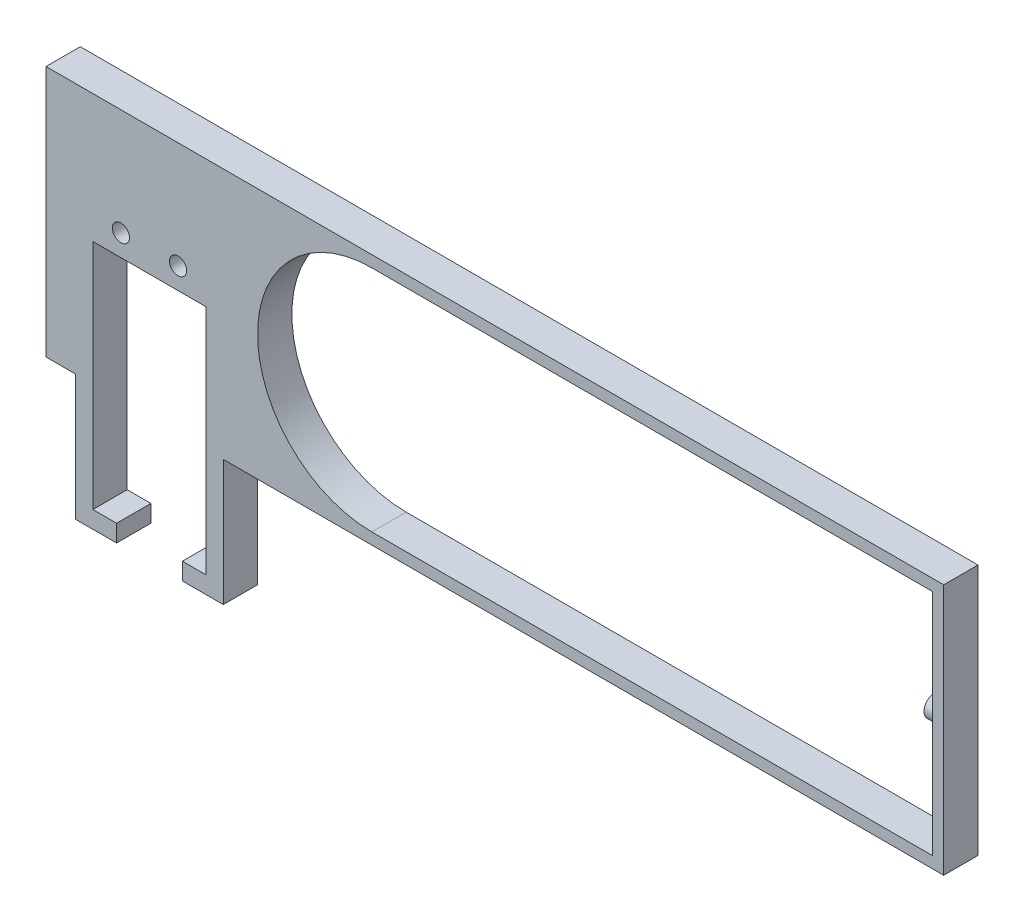
ISO-10303-21;
HEADER;
FILE_DESCRIPTION(('STEP AP214'),'2;1');
FILE_NAME('part.step','',(''),(''),'','','');
FILE_SCHEMA(('AUTOMOTIVE_DESIGN { 1 0 10303 214 1 1 1 1 }'));
ENDSEC;
DATA;
#1=APPLICATION_CONTEXT('core data for automotive mechanical design processes');
#2=APPLICATION_PROTOCOL_DEFINITION('international standard','automotive_design',2000,#1);
#3=PRODUCT_CONTEXT('',#1,'mechanical');
#4=PRODUCT('Part','Part','',(#3));
#5=PRODUCT_RELATED_PRODUCT_CATEGORY('part','',(#4));
#6=PRODUCT_DEFINITION_FORMATION('','',#4);
#7=PRODUCT_DEFINITION_CONTEXT('part definition',#1,'design');
#8=PRODUCT_DEFINITION('design','',#6,#7);
#9=PRODUCT_DEFINITION_SHAPE('','',#8);
#10=(LENGTH_UNIT() NAMED_UNIT(*) SI_UNIT(.MILLI.,.METRE.));
#11=(NAMED_UNIT(*) PLANE_ANGLE_UNIT() SI_UNIT($,.RADIAN.));
#12=(NAMED_UNIT(*) SI_UNIT($,.STERADIAN.) SOLID_ANGLE_UNIT());
#13=UNCERTAINTY_MEASURE_WITH_UNIT(LENGTH_MEASURE(1.E-05),#10,'distance_accuracy_value','');
#14=(GEOMETRIC_REPRESENTATION_CONTEXT(3) GLOBAL_UNCERTAINTY_ASSIGNED_CONTEXT((#13)) GLOBAL_UNIT_ASSIGNED_CONTEXT((#10,
#11,#12)) REPRESENTATION_CONTEXT('',''));
#15=CARTESIAN_POINT('',(0.,0.,0.));
#16=DIRECTION('',(0.,0.,1.));
#17=DIRECTION('',(1.,0.,0.));
#18=AXIS2_PLACEMENT_3D('',#15,#16,#17);
#19=CARTESIAN_POINT('',(0.,0.,6.));
#20=DIRECTION('',(0.,0.,1.));
#21=DIRECTION('',(1.,0.,0.));
#22=AXIS2_PLACEMENT_3D('',#19,#20,#21);
#23=PLANE('',#22);
#24=CARTESIAN_POINT('',(-43.9,25.353,6.));
#25=DIRECTION('',(0.,0.,1.));
#26=DIRECTION('',(1.,0.,0.));
#27=AXIS2_PLACEMENT_3D('',#24,#25,#26);
#28=CIRCLE('',#27,1.5);
#29=CARTESIAN_POINT('',(-42.4,25.353,6.));
#30=VERTEX_POINT('',#29);
#31=EDGE_CURVE('E235',#30,#30,#28,.T.);
#32=ORIENTED_EDGE('',*,*,#31,.F.);
#33=EDGE_LOOP('',(#32));
#34=FACE_BOUND('',#33,.T.);
#35=DIRECTION('',(1.,0.,0.));
#36=VECTOR('',#35,1.);
#37=CARTESIAN_POINT('',(0.,0.,6.));
#38=LINE('',#37,#36);
#39=CARTESIAN_POINT('',(-26.,0.,6.));
#40=VERTEX_POINT('',#39);
#41=CARTESIAN_POINT('',(100.,0.,6.));
#42=VERTEX_POINT('',#41);
#43=EDGE_CURVE('E243',#40,#42,#38,.T.);
#44=ORIENTED_EDGE('',*,*,#43,.T.);
#45=DIRECTION('',(0.,1.,0.));
#46=VECTOR('',#45,1.);
#47=CARTESIAN_POINT('',(100.,0.,6.));
#48=LINE('',#47,#46);
#49=CARTESIAN_POINT('',(100.,44.,6.));
#50=VERTEX_POINT('',#49);
#51=EDGE_CURVE('E246',#42,#50,#48,.T.);
#52=ORIENTED_EDGE('',*,*,#51,.T.);
#53=DIRECTION('',(-1.,0.,0.));
#54=VECTOR('',#53,1.);
#55=CARTESIAN_POINT('',(100.,44.,6.));
#56=LINE('',#55,#54);
#57=CARTESIAN_POINT('',(-57.,44.,6.));
#58=VERTEX_POINT('',#57);
#59=EDGE_CURVE('E250',#50,#58,#56,.T.);
#60=ORIENTED_EDGE('',*,*,#59,.T.);
#61=DIRECTION('',(0.,-1.,0.));
#62=VECTOR('',#61,1.);
#63=CARTESIAN_POINT('',(-57.,44.,6.));
#64=LINE('',#63,#62);
#65=CARTESIAN_POINT('',(-57.,0.,6.));
#66=VERTEX_POINT('',#65);
#67=EDGE_CURVE('E253',#58,#66,#64,.T.);
#68=ORIENTED_EDGE('',*,*,#67,.T.);
#69=DIRECTION('',(1.,0.,0.));
#70=VECTOR('',#69,1.);
#71=CARTESIAN_POINT('',(-57.,0.,6.));
#72=LINE('',#71,#70);
#73=CARTESIAN_POINT('',(-51.8,0.,6.));
#74=VERTEX_POINT('',#73);
#75=EDGE_CURVE('E256',#66,#74,#72,.T.);
#76=ORIENTED_EDGE('',*,*,#75,.T.);
#77=DIRECTION('',(0.,-1.,0.));
#78=VECTOR('',#77,1.);
#79=CARTESIAN_POINT('',(-51.8,0.,6.));
#80=LINE('',#79,#78);
#81=CARTESIAN_POINT('',(-51.8,-22.,6.));
#82=VERTEX_POINT('',#81);
#83=EDGE_CURVE('E259',#74,#82,#80,.T.);
#84=ORIENTED_EDGE('',*,*,#83,.T.);
#85=DIRECTION('',(1.,0.,0.));
#86=VECTOR('',#85,1.);
#87=CARTESIAN_POINT('',(-51.8,-22.,6.));
#88=LINE('',#87,#86);
#89=CARTESIAN_POINT('',(-44.65,-22.,6.));
#90=VERTEX_POINT('',#89);
#91=EDGE_CURVE('E262',#82,#90,#88,.T.);
#92=ORIENTED_EDGE('',*,*,#91,.T.);
#93=DIRECTION('',(0.,1.,0.));
#94=VECTOR('',#93,1.);
#95=CARTESIAN_POINT('',(-44.65,-22.,6.));
#96=LINE('',#95,#94);
#97=CARTESIAN_POINT('',(-44.65,-19.,6.));
#98=VERTEX_POINT('',#97);
#99=EDGE_CURVE('E265',#90,#98,#96,.T.);
#100=ORIENTED_EDGE('',*,*,#99,.T.);
#101=DIRECTION('',(-1.,0.,0.));
#102=VECTOR('',#101,1.);
#103=CARTESIAN_POINT('',(-44.65,-19.,6.));
#104=LINE('',#103,#102);
#105=CARTESIAN_POINT('',(-48.8,-19.,6.));
#106=VERTEX_POINT('',#105);
#107=EDGE_CURVE('E268',#98,#106,#104,.T.);
#108=ORIENTED_EDGE('',*,*,#107,.T.);
#109=DIRECTION('',(0.,1.,0.));
#110=VECTOR('',#109,1.);
#111=CARTESIAN_POINT('',(-48.8,-19.,6.));
#112=LINE('',#111,#110);
#113=CARTESIAN_POINT('',(-48.8,21.6,6.));
#114=VERTEX_POINT('',#113);
#115=EDGE_CURVE('E271',#106,#114,#112,.T.);
#116=ORIENTED_EDGE('',*,*,#115,.T.);
#117=DIRECTION('',(1.,0.,0.));
#118=VECTOR('',#117,1.);
#119=CARTESIAN_POINT('',(-48.8,21.6,6.));
#120=LINE('',#119,#118);
#121=CARTESIAN_POINT('',(-29.,21.6,6.));
#122=VERTEX_POINT('',#121);
#123=EDGE_CURVE('E274',#114,#122,#120,.T.);
#124=ORIENTED_EDGE('',*,*,#123,.T.);
#125=DIRECTION('',(0.,-1.,0.));
#126=VECTOR('',#125,1.);
#127=CARTESIAN_POINT('',(-29.,21.6,6.));
#128=LINE('',#127,#126);
#129=CARTESIAN_POINT('',(-29.,-19.,6.));
#130=VERTEX_POINT('',#129);
#131=EDGE_CURVE('E277',#122,#130,#128,.T.);
#132=ORIENTED_EDGE('',*,*,#131,.T.);
#133=DIRECTION('',(-1.,0.,0.));
#134=VECTOR('',#133,1.);
#135=CARTESIAN_POINT('',(-29.,-19.,6.));
#136=LINE('',#135,#134);
#137=CARTESIAN_POINT('',(-33.15,-19.,6.));
#138=VERTEX_POINT('',#137);
#139=EDGE_CURVE('E280',#130,#138,#136,.T.);
#140=ORIENTED_EDGE('',*,*,#139,.T.);
#141=DIRECTION('',(0.,-1.,0.));
#142=VECTOR('',#141,1.);
#143=CARTESIAN_POINT('',(-33.15,-19.,6.));
#144=LINE('',#143,#142);
#145=CARTESIAN_POINT('',(-33.15,-22.,6.));
#146=VERTEX_POINT('',#145);
#147=EDGE_CURVE('E283',#138,#146,#144,.T.);
#148=ORIENTED_EDGE('',*,*,#147,.T.);
#149=DIRECTION('',(1.,0.,0.));
#150=VECTOR('',#149,1.);
#151=CARTESIAN_POINT('',(-33.15,-22.,6.));
#152=LINE('',#151,#150);
#153=CARTESIAN_POINT('',(-26.,-22.,6.));
#154=VERTEX_POINT('',#153);
#155=EDGE_CURVE('E286',#146,#154,#152,.T.);
#156=ORIENTED_EDGE('',*,*,#155,.T.);
#157=DIRECTION('',(0.,1.,0.));
#158=VECTOR('',#157,1.);
#159=CARTESIAN_POINT('',(-26.,0.,6.));
#160=LINE('',#159,#158);
#161=EDGE_CURVE('E289',#154,#40,#160,.T.);
#162=ORIENTED_EDGE('',*,*,#161,.T.);
#163=EDGE_LOOP('',(#44,#52,#60,#68,#76,#84,#92,#100,#108,#116,#124,#132,#140,#148,#156,#162));
#164=FACE_BOUND('',#163,.T.);
#165=CARTESIAN_POINT('',(-33.9,25.353,6.));
#166=DIRECTION('',(0.,0.,1.));
#167=DIRECTION('',(1.,0.,0.));
#168=AXIS2_PLACEMENT_3D('',#165,#166,#167);
#169=CIRCLE('',#168,1.5);
#170=CARTESIAN_POINT('',(-32.4,25.353,6.));
#171=VERTEX_POINT('',#170);
#172=EDGE_CURVE('E227',#171,#171,#169,.T.);
#173=ORIENTED_EDGE('',*,*,#172,.F.);
#174=EDGE_LOOP('',(#173));
#175=FACE_BOUND('',#174,.T.);
#176=DIRECTION('',(1.,0.,0.));
#177=VECTOR('',#176,1.);
#178=CARTESIAN_POINT('',(0.,2.,6.));
#179=LINE('',#178,#177);
#180=CARTESIAN_POINT('',(0.,2.,6.));
#181=VERTEX_POINT('',#180);
#182=CARTESIAN_POINT('',(98.,2.00000000000004,6.));
#183=VERTEX_POINT('',#182);
#184=EDGE_CURVE('E186',#181,#183,#179,.T.);
#185=ORIENTED_EDGE('',*,*,#184,.F.);
#186=CARTESIAN_POINT('',(0.,22.,6.));
#187=DIRECTION('',(0.,0.,1.));
#188=DIRECTION('',(1.,0.,0.));
#189=AXIS2_PLACEMENT_3D('',#186,#187,#188);
#190=CIRCLE('',#189,20.);
#191=CARTESIAN_POINT('',(0.,42.,6.));
#192=VERTEX_POINT('',#191);
#193=EDGE_CURVE('E177',#192,#181,#190,.T.);
#194=ORIENTED_EDGE('',*,*,#193,.F.);
#195=DIRECTION('',(-1.,0.,0.));
#196=VECTOR('',#195,1.);
#197=CARTESIAN_POINT('',(98.,42.,6.));
#198=LINE('',#197,#196);
#199=CARTESIAN_POINT('',(98.,42.,6.));
#200=VERTEX_POINT('',#199);
#201=EDGE_CURVE('E203',#200,#192,#198,.T.);
#202=ORIENTED_EDGE('',*,*,#201,.F.);
#203=DIRECTION('',(0.,1.,0.));
#204=VECTOR('',#203,1.);
#205=CARTESIAN_POINT('',(98.,2.00000000000004,6.));
#206=LINE('',#205,#204);
#207=EDGE_CURVE('E199',#183,#200,#206,.T.);
#208=ORIENTED_EDGE('',*,*,#207,.F.);
#209=EDGE_LOOP('',(#185,#194,#202,#208));
#210=FACE_BOUND('',#209,.T.);
#211=ADVANCED_FACE('F39',(#34,#164,#175,#210),#23,.T.);
#212=CARTESIAN_POINT('',(0.,0.,0.));
#213=DIRECTION('',(0.,0.,1.));
#214=DIRECTION('',(1.,0.,0.));
#215=AXIS2_PLACEMENT_3D('',#212,#213,#214);
#216=PLANE('',#215);
#217=CARTESIAN_POINT('',(-33.9,25.353,0.));
#218=DIRECTION('',(0.,0.,1.));
#219=DIRECTION('',(1.,0.,0.));
#220=AXIS2_PLACEMENT_3D('',#217,#218,#219);
#221=CIRCLE('',#220,1.5);
#222=CARTESIAN_POINT('',(-32.4,25.353,0.));
#223=VERTEX_POINT('',#222);
#224=EDGE_CURVE('E195',#223,#223,#221,.T.);
#225=ORIENTED_EDGE('',*,*,#224,.T.);
#226=EDGE_LOOP('',(#225));
#227=FACE_BOUND('',#226,.T.);
#228=CARTESIAN_POINT('',(-43.9,25.353,0.));
#229=DIRECTION('',(0.,0.,1.));
#230=DIRECTION('',(1.,0.,0.));
#231=AXIS2_PLACEMENT_3D('',#228,#229,#230);
#232=CIRCLE('',#231,1.5);
#233=CARTESIAN_POINT('',(-42.4,25.353,0.));
#234=VERTEX_POINT('',#233);
#235=EDGE_CURVE('E231',#234,#234,#232,.T.);
#236=ORIENTED_EDGE('',*,*,#235,.T.);
#237=EDGE_LOOP('',(#236));
#238=FACE_BOUND('',#237,.T.);
#239=DIRECTION('',(1.,0.,0.));
#240=VECTOR('',#239,1.);
#241=CARTESIAN_POINT('',(0.,0.,0.));
#242=LINE('',#241,#240);
#243=CARTESIAN_POINT('',(-26.,0.,0.));
#244=VERTEX_POINT('',#243);
#245=CARTESIAN_POINT('',(100.,0.,0.));
#246=VERTEX_POINT('',#245);
#247=EDGE_CURVE('E239',#244,#246,#242,.T.);
#248=ORIENTED_EDGE('',*,*,#247,.F.);
#249=DIRECTION('',(0.,1.,0.));
#250=VECTOR('',#249,1.);
#251=CARTESIAN_POINT('',(-26.,0.,0.));
#252=LINE('',#251,#250);
#253=CARTESIAN_POINT('',(-26.,-22.,0.));
#254=VERTEX_POINT('',#253);
#255=EDGE_CURVE('E247',#254,#244,#252,.T.);
#256=ORIENTED_EDGE('',*,*,#255,.F.);
#257=DIRECTION('',(1.,0.,0.));
#258=VECTOR('',#257,1.);
#259=CARTESIAN_POINT('',(-33.15,-22.,0.));
#260=LINE('',#259,#258);
#261=CARTESIAN_POINT('',(-33.15,-22.,0.));
#262=VERTEX_POINT('',#261);
#263=EDGE_CURVE('E335',#262,#254,#260,.T.);
#264=ORIENTED_EDGE('',*,*,#263,.F.);
#265=DIRECTION('',(0.,-1.,0.));
#266=VECTOR('',#265,1.);
#267=CARTESIAN_POINT('',(-33.15,-19.,0.));
#268=LINE('',#267,#266);
#269=CARTESIAN_POINT('',(-33.15,-19.,0.));
#270=VERTEX_POINT('',#269);
#271=EDGE_CURVE('E332',#270,#262,#268,.T.);
#272=ORIENTED_EDGE('',*,*,#271,.F.);
#273=DIRECTION('',(-1.,0.,0.));
#274=VECTOR('',#273,1.);
#275=CARTESIAN_POINT('',(-29.,-19.,0.));
#276=LINE('',#275,#274);
#277=CARTESIAN_POINT('',(-29.,-19.,0.));
#278=VERTEX_POINT('',#277);
#279=EDGE_CURVE('E329',#278,#270,#276,.T.);
#280=ORIENTED_EDGE('',*,*,#279,.F.);
#281=DIRECTION('',(0.,-1.,0.));
#282=VECTOR('',#281,1.);
#283=CARTESIAN_POINT('',(-29.,21.6,0.));
#284=LINE('',#283,#282);
#285=CARTESIAN_POINT('',(-29.,21.6,0.));
#286=VERTEX_POINT('',#285);
#287=EDGE_CURVE('E326',#286,#278,#284,.T.);
#288=ORIENTED_EDGE('',*,*,#287,.F.);
#289=DIRECTION('',(1.,0.,0.));
#290=VECTOR('',#289,1.);
#291=CARTESIAN_POINT('',(-48.8,21.6,0.));
#292=LINE('',#291,#290);
#293=CARTESIAN_POINT('',(-48.8,21.6,0.));
#294=VERTEX_POINT('',#293);
#295=EDGE_CURVE('E323',#294,#286,#292,.T.);
#296=ORIENTED_EDGE('',*,*,#295,.F.);
#297=DIRECTION('',(0.,1.,0.));
#298=VECTOR('',#297,1.);
#299=CARTESIAN_POINT('',(-48.8,-19.,0.));
#300=LINE('',#299,#298);
#301=CARTESIAN_POINT('',(-48.8,-19.,0.));
#302=VERTEX_POINT('',#301);
#303=EDGE_CURVE('E320',#302,#294,#300,.T.);
#304=ORIENTED_EDGE('',*,*,#303,.F.);
#305=DIRECTION('',(-1.,0.,0.));
#306=VECTOR('',#305,1.);
#307=CARTESIAN_POINT('',(-44.65,-19.,0.));
#308=LINE('',#307,#306);
#309=CARTESIAN_POINT('',(-44.65,-19.,0.));
#310=VERTEX_POINT('',#309);
#311=EDGE_CURVE('E317',#310,#302,#308,.T.);
#312=ORIENTED_EDGE('',*,*,#311,.F.);
#313=DIRECTION('',(0.,1.,0.));
#314=VECTOR('',#313,1.);
#315=CARTESIAN_POINT('',(-44.65,-22.,0.));
#316=LINE('',#315,#314);
#317=CARTESIAN_POINT('',(-44.65,-22.,0.));
#318=VERTEX_POINT('',#317);
#319=EDGE_CURVE('E314',#318,#310,#316,.T.);
#320=ORIENTED_EDGE('',*,*,#319,.F.);
#321=DIRECTION('',(1.,0.,0.));
#322=VECTOR('',#321,1.);
#323=CARTESIAN_POINT('',(-51.8,-22.,0.));
#324=LINE('',#323,#322);
#325=CARTESIAN_POINT('',(-51.8,-22.,0.));
#326=VERTEX_POINT('',#325);
#327=EDGE_CURVE('E311',#326,#318,#324,.T.);
#328=ORIENTED_EDGE('',*,*,#327,.F.);
#329=DIRECTION('',(0.,-1.,0.));
#330=VECTOR('',#329,1.);
#331=CARTESIAN_POINT('',(-51.8,0.,0.));
#332=LINE('',#331,#330);
#333=CARTESIAN_POINT('',(-51.8,0.,0.));
#334=VERTEX_POINT('',#333);
#335=EDGE_CURVE('E308',#334,#326,#332,.T.);
#336=ORIENTED_EDGE('',*,*,#335,.F.);
#337=DIRECTION('',(1.,0.,0.));
#338=VECTOR('',#337,1.);
#339=CARTESIAN_POINT('',(-57.,0.,0.));
#340=LINE('',#339,#338);
#341=CARTESIAN_POINT('',(-57.,0.,0.));
#342=VERTEX_POINT('',#341);
#343=EDGE_CURVE('E305',#342,#334,#340,.T.);
#344=ORIENTED_EDGE('',*,*,#343,.F.);
#345=DIRECTION('',(0.,-1.,0.));
#346=VECTOR('',#345,1.);
#347=CARTESIAN_POINT('',(-57.,44.,0.));
#348=LINE('',#347,#346);
#349=CARTESIAN_POINT('',(-57.,44.,0.));
#350=VERTEX_POINT('',#349);
#351=EDGE_CURVE('E302',#350,#342,#348,.T.);
#352=ORIENTED_EDGE('',*,*,#351,.F.);
#353=DIRECTION('',(-1.,0.,0.));
#354=VECTOR('',#353,1.);
#355=CARTESIAN_POINT('',(0.,44.,0.));
#356=LINE('',#355,#354);
#357=CARTESIAN_POINT('',(100.,44.,0.));
#358=VERTEX_POINT('',#357);
#359=EDGE_CURVE('E299',#358,#350,#356,.T.);
#360=ORIENTED_EDGE('',*,*,#359,.F.);
#361=DIRECTION('',(0.,1.,0.));
#362=VECTOR('',#361,1.);
#363=CARTESIAN_POINT('',(100.,0.,0.));
#364=LINE('',#363,#362);
#365=EDGE_CURVE('E295',#246,#358,#364,.T.);
#366=ORIENTED_EDGE('',*,*,#365,.F.);
#367=EDGE_LOOP('',(#248,#256,#264,#272,#280,#288,#296,#304,#312,#320,#328,#336,#344,#352,#360,#366));
#368=FACE_BOUND('',#367,.T.);
#369=CARTESIAN_POINT('',(0.,22.,0.));
#370=DIRECTION('',(0.,0.,1.));
#371=DIRECTION('',(1.,0.,0.));
#372=AXIS2_PLACEMENT_3D('',#369,#370,#371);
#373=CIRCLE('',#372,20.);
#374=CARTESIAN_POINT('',(0.,42.,0.));
#375=VERTEX_POINT('',#374);
#376=CARTESIAN_POINT('',(0.,2.,0.));
#377=VERTEX_POINT('',#376);
#378=EDGE_CURVE('E63',#375,#377,#373,.T.);
#379=ORIENTED_EDGE('',*,*,#378,.T.);
#380=DIRECTION('',(1.,0.,0.));
#381=VECTOR('',#380,1.);
#382=CARTESIAN_POINT('',(0.,2.,0.));
#383=LINE('',#382,#381);
#384=CARTESIAN_POINT('',(98.,2.00000000000004,0.));
#385=VERTEX_POINT('',#384);
#386=EDGE_CURVE('E193',#377,#385,#383,.T.);
#387=ORIENTED_EDGE('',*,*,#386,.T.);
#388=DIRECTION('',(0.,1.,0.));
#389=VECTOR('',#388,1.);
#390=CARTESIAN_POINT('',(98.,2.00000000000004,0.));
#391=LINE('',#390,#389);
#392=CARTESIAN_POINT('',(98.,42.,0.));
#393=VERTEX_POINT('',#392);
#394=EDGE_CURVE('E214',#385,#393,#391,.T.);
#395=ORIENTED_EDGE('',*,*,#394,.T.);
#396=DIRECTION('',(-1.,0.,0.));
#397=VECTOR('',#396,1.);
#398=CARTESIAN_POINT('',(98.,42.,0.));
#399=LINE('',#398,#397);
#400=EDGE_CURVE('E187',#393,#375,#399,.T.);
#401=ORIENTED_EDGE('',*,*,#400,.T.);
#402=EDGE_LOOP('',(#379,#387,#395,#401));
#403=FACE_BOUND('',#402,.T.);
#404=ADVANCED_FACE('F408',(#227,#238,#368,#403),#216,.F.);
#405=CARTESIAN_POINT('',(0.,0.,6.));
#406=DIRECTION('',(0.,1.,0.));
#407=DIRECTION('',(0.,0.,1.));
#408=AXIS2_PLACEMENT_3D('',#405,#406,#407);
#409=PLANE('',#408);
#410=ORIENTED_EDGE('',*,*,#247,.T.);
#411=DIRECTION('',(0.,0.,-1.));
#412=VECTOR('',#411,1.);
#413=CARTESIAN_POINT('',(100.,0.,6.));
#414=LINE('',#413,#412);
#415=EDGE_CURVE('E11',#42,#246,#414,.T.);
#416=ORIENTED_EDGE('',*,*,#415,.F.);
#417=ORIENTED_EDGE('',*,*,#43,.F.);
#418=DIRECTION('',(0.,0.,-1.));
#419=VECTOR('',#418,1.);
#420=CARTESIAN_POINT('',(-26.,0.,6.));
#421=LINE('',#420,#419);
#422=EDGE_CURVE('E292',#40,#244,#421,.T.);
#423=ORIENTED_EDGE('',*,*,#422,.T.);
#424=EDGE_LOOP('',(#410,#416,#417,#423));
#425=FACE_BOUND('',#424,.T.);
#426=ADVANCED_FACE('F41',(#425),#409,.F.);
#427=CARTESIAN_POINT('',(100.,0.,6.));
#428=DIRECTION('',(-1.,0.,0.));
#429=DIRECTION('',(0.,0.,1.));
#430=AXIS2_PLACEMENT_3D('',#427,#428,#429);
#431=PLANE('',#430);
#432=ORIENTED_EDGE('',*,*,#365,.T.);
#433=DIRECTION('',(0.,0.,-1.));
#434=VECTOR('',#433,1.);
#435=CARTESIAN_POINT('',(100.,44.,6.));
#436=LINE('',#435,#434);
#437=EDGE_CURVE('E48',#50,#358,#436,.T.);
#438=ORIENTED_EDGE('',*,*,#437,.F.);
#439=ORIENTED_EDGE('',*,*,#51,.F.);
#440=ORIENTED_EDGE('',*,*,#415,.T.);
#441=EDGE_LOOP('',(#432,#438,#439,#440));
#442=FACE_BOUND('',#441,.T.);
#443=ADVANCED_FACE('F404',(#442),#431,.F.);
#444=CARTESIAN_POINT('',(0.,44.,6.));
#445=DIRECTION('',(0.,-1.,0.));
#446=DIRECTION('',(1.,0.,0.));
#447=AXIS2_PLACEMENT_3D('',#444,#445,#446);
#448=PLANE('',#447);
#449=ORIENTED_EDGE('',*,*,#359,.T.);
#450=DIRECTION('',(0.,0.,-1.));
#451=VECTOR('',#450,1.);
#452=CARTESIAN_POINT('',(-57.,44.,6.));
#453=LINE('',#452,#451);
#454=EDGE_CURVE('E392',#58,#350,#453,.T.);
#455=ORIENTED_EDGE('',*,*,#454,.F.);
#456=ORIENTED_EDGE('',*,*,#59,.F.);
#457=ORIENTED_EDGE('',*,*,#437,.T.);
#458=EDGE_LOOP('',(#449,#455,#456,#457));
#459=FACE_BOUND('',#458,.T.);
#460=ADVANCED_FACE('F400',(#459),#448,.F.);
#461=CARTESIAN_POINT('',(-57.,44.,6.));
#462=DIRECTION('',(1.,0.,0.));
#463=DIRECTION('',(0.,1.,0.));
#464=AXIS2_PLACEMENT_3D('',#461,#462,#463);
#465=PLANE('',#464);
#466=ORIENTED_EDGE('',*,*,#351,.T.);
#467=DIRECTION('',(0.,0.,-1.));
#468=VECTOR('',#467,1.);
#469=CARTESIAN_POINT('',(-57.,0.,6.));
#470=LINE('',#469,#468);
#471=EDGE_CURVE('E388',#66,#342,#470,.T.);
#472=ORIENTED_EDGE('',*,*,#471,.F.);
#473=ORIENTED_EDGE('',*,*,#67,.F.);
#474=ORIENTED_EDGE('',*,*,#454,.T.);
#475=EDGE_LOOP('',(#466,#472,#473,#474));
#476=FACE_BOUND('',#475,.T.);
#477=ADVANCED_FACE('F416',(#476),#465,.F.);
#478=CARTESIAN_POINT('',(-57.,0.,6.));
#479=DIRECTION('',(0.,1.,0.));
#480=DIRECTION('',(-1.,0.,0.));
#481=AXIS2_PLACEMENT_3D('',#478,#479,#480);
#482=PLANE('',#481);
#483=ORIENTED_EDGE('',*,*,#343,.T.);
#484=DIRECTION('',(0.,0.,-1.));
#485=VECTOR('',#484,1.);
#486=CARTESIAN_POINT('',(-51.8,0.,6.));
#487=LINE('',#486,#485);
#488=EDGE_CURVE('E384',#74,#334,#487,.T.);
#489=ORIENTED_EDGE('',*,*,#488,.F.);
#490=ORIENTED_EDGE('',*,*,#75,.F.);
#491=ORIENTED_EDGE('',*,*,#471,.T.);
#492=EDGE_LOOP('',(#483,#489,#490,#491));
#493=FACE_BOUND('',#492,.T.);
#494=ADVANCED_FACE('F420',(#493),#482,.F.);
#495=CARTESIAN_POINT('',(-51.8,0.,6.));
#496=DIRECTION('',(1.,0.,0.));
#497=DIRECTION('',(0.,0.,-1.));
#498=AXIS2_PLACEMENT_3D('',#495,#496,#497);
#499=PLANE('',#498);
#500=ORIENTED_EDGE('',*,*,#335,.T.);
#501=DIRECTION('',(0.,0.,-1.));
#502=VECTOR('',#501,1.);
#503=CARTESIAN_POINT('',(-51.8,-22.,6.));
#504=LINE('',#503,#502);
#505=EDGE_CURVE('E380',#82,#326,#504,.T.);
#506=ORIENTED_EDGE('',*,*,#505,.F.);
#507=ORIENTED_EDGE('',*,*,#83,.F.);
#508=ORIENTED_EDGE('',*,*,#488,.T.);
#509=EDGE_LOOP('',(#500,#506,#507,#508));
#510=FACE_BOUND('',#509,.T.);
#511=ADVANCED_FACE('F478',(#510),#499,.F.);
#512=CARTESIAN_POINT('',(-51.8,-22.,6.));
#513=DIRECTION('',(0.,1.,0.));
#514=DIRECTION('',(0.,0.,1.));
#515=AXIS2_PLACEMENT_3D('',#512,#513,#514);
#516=PLANE('',#515);
#517=ORIENTED_EDGE('',*,*,#327,.T.);
#518=DIRECTION('',(0.,0.,-1.));
#519=VECTOR('',#518,1.);
#520=CARTESIAN_POINT('',(-44.65,-22.,6.));
#521=LINE('',#520,#519);
#522=EDGE_CURVE('E376',#90,#318,#521,.T.);
#523=ORIENTED_EDGE('',*,*,#522,.F.);
#524=ORIENTED_EDGE('',*,*,#91,.F.);
#525=ORIENTED_EDGE('',*,*,#505,.T.);
#526=EDGE_LOOP('',(#517,#523,#524,#525));
#527=FACE_BOUND('',#526,.T.);
#528=ADVANCED_FACE('F476',(#527),#516,.F.);
#529=CARTESIAN_POINT('',(-44.65,-22.,6.));
#530=DIRECTION('',(-1.,0.,0.));
#531=DIRECTION('',(0.,-1.,0.));
#532=AXIS2_PLACEMENT_3D('',#529,#530,#531);
#533=PLANE('',#532);
#534=ORIENTED_EDGE('',*,*,#319,.T.);
#535=DIRECTION('',(0.,0.,-1.));
#536=VECTOR('',#535,1.);
#537=CARTESIAN_POINT('',(-44.65,-19.,6.));
#538=LINE('',#537,#536);
#539=EDGE_CURVE('E372',#98,#310,#538,.T.);
#540=ORIENTED_EDGE('',*,*,#539,.F.);
#541=ORIENTED_EDGE('',*,*,#99,.F.);
#542=ORIENTED_EDGE('',*,*,#522,.T.);
#543=EDGE_LOOP('',(#534,#540,#541,#542));
#544=FACE_BOUND('',#543,.T.);
#545=ADVANCED_FACE('F472',(#544),#533,.F.);
#546=CARTESIAN_POINT('',(-44.65,-19.,6.));
#547=DIRECTION('',(0.,-1.,0.));
#548=DIRECTION('',(1.,0.,0.));
#549=AXIS2_PLACEMENT_3D('',#546,#547,#548);
#550=PLANE('',#549);
#551=ORIENTED_EDGE('',*,*,#311,.T.);
#552=DIRECTION('',(0.,0.,-1.));
#553=VECTOR('',#552,1.);
#554=CARTESIAN_POINT('',(-48.8,-19.,6.));
#555=LINE('',#554,#553);
#556=EDGE_CURVE('E368',#106,#302,#555,.T.);
#557=ORIENTED_EDGE('',*,*,#556,.F.);
#558=ORIENTED_EDGE('',*,*,#107,.F.);
#559=ORIENTED_EDGE('',*,*,#539,.T.);
#560=EDGE_LOOP('',(#551,#557,#558,#559));
#561=FACE_BOUND('',#560,.T.);
#562=ADVANCED_FACE('F467',(#561),#550,.F.);
#563=CARTESIAN_POINT('',(-48.8,-19.,6.));
#564=DIRECTION('',(-1.,0.,0.));
#565=DIRECTION('',(0.,-1.,0.));
#566=AXIS2_PLACEMENT_3D('',#563,#564,#565);
#567=PLANE('',#566);
#568=ORIENTED_EDGE('',*,*,#303,.T.);
#569=DIRECTION('',(0.,0.,-1.));
#570=VECTOR('',#569,1.);
#571=CARTESIAN_POINT('',(-48.8,21.6,6.));
#572=LINE('',#571,#570);
#573=EDGE_CURVE('E364',#114,#294,#572,.T.);
#574=ORIENTED_EDGE('',*,*,#573,.F.);
#575=ORIENTED_EDGE('',*,*,#115,.F.);
#576=ORIENTED_EDGE('',*,*,#556,.T.);
#577=EDGE_LOOP('',(#568,#574,#575,#576));
#578=FACE_BOUND('',#577,.T.);
#579=ADVANCED_FACE('F461',(#578),#567,.F.);
#580=CARTESIAN_POINT('',(-48.8,21.6,6.));
#581=DIRECTION('',(0.,1.,0.));
#582=DIRECTION('',(-1.,0.,0.));
#583=AXIS2_PLACEMENT_3D('',#580,#581,#582);
#584=PLANE('',#583);
#585=ORIENTED_EDGE('',*,*,#295,.T.);
#586=DIRECTION('',(0.,0.,-1.));
#587=VECTOR('',#586,1.);
#588=CARTESIAN_POINT('',(-29.,21.6,6.));
#589=LINE('',#588,#587);
#590=EDGE_CURVE('E360',#122,#286,#589,.T.);
#591=ORIENTED_EDGE('',*,*,#590,.F.);
#592=ORIENTED_EDGE('',*,*,#123,.F.);
#593=ORIENTED_EDGE('',*,*,#573,.T.);
#594=EDGE_LOOP('',(#585,#591,#592,#593));
#595=FACE_BOUND('',#594,.T.);
#596=ADVANCED_FACE('F457',(#595),#584,.F.);
#597=CARTESIAN_POINT('',(-29.,21.6,6.));
#598=DIRECTION('',(1.,0.,0.));
#599=DIRECTION('',(0.,1.,0.));
#600=AXIS2_PLACEMENT_3D('',#597,#598,#599);
#601=PLANE('',#600);
#602=ORIENTED_EDGE('',*,*,#287,.T.);
#603=DIRECTION('',(0.,0.,-1.));
#604=VECTOR('',#603,1.);
#605=CARTESIAN_POINT('',(-29.,-19.,6.));
#606=LINE('',#605,#604);
#607=EDGE_CURVE('E356',#130,#278,#606,.T.);
#608=ORIENTED_EDGE('',*,*,#607,.F.);
#609=ORIENTED_EDGE('',*,*,#131,.F.);
#610=ORIENTED_EDGE('',*,*,#590,.T.);
#611=EDGE_LOOP('',(#602,#608,#609,#610));
#612=FACE_BOUND('',#611,.T.);
#613=ADVANCED_FACE('F452',(#612),#601,.F.);
#614=CARTESIAN_POINT('',(-29.,-19.,6.));
#615=DIRECTION('',(0.,-1.,0.));
#616=DIRECTION('',(1.,0.,0.));
#617=AXIS2_PLACEMENT_3D('',#614,#615,#616);
#618=PLANE('',#617);
#619=ORIENTED_EDGE('',*,*,#279,.T.);
#620=DIRECTION('',(0.,0.,-1.));
#621=VECTOR('',#620,1.);
#622=CARTESIAN_POINT('',(-33.15,-19.,6.));
#623=LINE('',#622,#621);
#624=EDGE_CURVE('E352',#138,#270,#623,.T.);
#625=ORIENTED_EDGE('',*,*,#624,.F.);
#626=ORIENTED_EDGE('',*,*,#139,.F.);
#627=ORIENTED_EDGE('',*,*,#607,.T.);
#628=EDGE_LOOP('',(#619,#625,#626,#627));
#629=FACE_BOUND('',#628,.T.);
#630=ADVANCED_FACE('F446',(#629),#618,.F.);
#631=CARTESIAN_POINT('',(-33.15,-19.,6.));
#632=DIRECTION('',(1.,0.,0.));
#633=DIRECTION('',(0.,1.,0.));
#634=AXIS2_PLACEMENT_3D('',#631,#632,#633);
#635=PLANE('',#634);
#636=ORIENTED_EDGE('',*,*,#271,.T.);
#637=DIRECTION('',(0.,0.,-1.));
#638=VECTOR('',#637,1.);
#639=CARTESIAN_POINT('',(-33.15,-22.,6.));
#640=LINE('',#639,#638);
#641=EDGE_CURVE('E348',#146,#262,#640,.T.);
#642=ORIENTED_EDGE('',*,*,#641,.F.);
#643=ORIENTED_EDGE('',*,*,#147,.F.);
#644=ORIENTED_EDGE('',*,*,#624,.T.);
#645=EDGE_LOOP('',(#636,#642,#643,#644));
#646=FACE_BOUND('',#645,.T.);
#647=ADVANCED_FACE('F442',(#646),#635,.F.);
#648=CARTESIAN_POINT('',(-33.15,-22.,6.));
#649=DIRECTION('',(0.,1.,0.));
#650=DIRECTION('',(-1.,0.,0.));
#651=AXIS2_PLACEMENT_3D('',#648,#649,#650);
#652=PLANE('',#651);
#653=ORIENTED_EDGE('',*,*,#263,.T.);
#654=DIRECTION('',(0.,0.,-1.));
#655=VECTOR('',#654,1.);
#656=CARTESIAN_POINT('',(-26.,-22.,6.));
#657=LINE('',#656,#655);
#658=EDGE_CURVE('E344',#154,#254,#657,.T.);
#659=ORIENTED_EDGE('',*,*,#658,.F.);
#660=ORIENTED_EDGE('',*,*,#155,.F.);
#661=ORIENTED_EDGE('',*,*,#641,.T.);
#662=EDGE_LOOP('',(#653,#659,#660,#661));
#663=FACE_BOUND('',#662,.T.);
#664=ADVANCED_FACE('F437',(#663),#652,.F.);
#665=CARTESIAN_POINT('',(-26.,0.,6.));
#666=DIRECTION('',(-1.,0.,0.));
#667=DIRECTION('',(0.,-1.,0.));
#668=AXIS2_PLACEMENT_3D('',#665,#666,#667);
#669=PLANE('',#668);
#670=ORIENTED_EDGE('',*,*,#255,.T.);
#671=ORIENTED_EDGE('',*,*,#422,.F.);
#672=ORIENTED_EDGE('',*,*,#161,.F.);
#673=ORIENTED_EDGE('',*,*,#658,.T.);
#674=EDGE_LOOP('',(#670,#671,#672,#673));
#675=FACE_BOUND('',#674,.T.);
#676=ADVANCED_FACE('F431',(#675),#669,.F.);
#677=CARTESIAN_POINT('',(-43.9,25.353,6.));
#678=DIRECTION('',(0.,0.,-1.));
#679=DIRECTION('',(-1.,0.,0.));
#680=AXIS2_PLACEMENT_3D('',#677,#678,#679);
#681=CYLINDRICAL_SURFACE('',#680,1.5);
#682=ORIENTED_EDGE('',*,*,#31,.T.);
#683=EDGE_LOOP('',(#682));
#684=FACE_BOUND('',#683,.T.);
#685=ORIENTED_EDGE('',*,*,#235,.F.);
#686=EDGE_LOOP('',(#685));
#687=FACE_BOUND('',#686,.T.);
#688=ADVANCED_FACE('F497',(#684,#687),#681,.F.);
#689=CARTESIAN_POINT('',(-33.9,25.353,6.));
#690=DIRECTION('',(0.,0.,-1.));
#691=DIRECTION('',(-1.,0.,0.));
#692=AXIS2_PLACEMENT_3D('',#689,#690,#691);
#693=CYLINDRICAL_SURFACE('',#692,1.5);
#694=ORIENTED_EDGE('',*,*,#172,.T.);
#695=EDGE_LOOP('',(#694));
#696=FACE_BOUND('',#695,.T.);
#697=ORIENTED_EDGE('',*,*,#224,.F.);
#698=EDGE_LOOP('',(#697));
#699=FACE_BOUND('',#698,.T.);
#700=ADVANCED_FACE('F559',(#696,#699),#693,.F.);
#701=CARTESIAN_POINT('',(0.,22.,6.));
#702=DIRECTION('',(0.,0.,-1.));
#703=DIRECTION('',(-1.,0.,0.));
#704=AXIS2_PLACEMENT_3D('',#701,#702,#703);
#705=CYLINDRICAL_SURFACE('',#704,20.);
#706=ORIENTED_EDGE('',*,*,#378,.F.);
#707=DIRECTION('',(0.,0.,-1.));
#708=VECTOR('',#707,1.);
#709=CARTESIAN_POINT('',(0.,42.,6.));
#710=LINE('',#709,#708);
#711=EDGE_CURVE('E181',#192,#375,#710,.T.);
#712=ORIENTED_EDGE('',*,*,#711,.F.);
#713=ORIENTED_EDGE('',*,*,#193,.T.);
#714=DIRECTION('',(0.,0.,-1.));
#715=VECTOR('',#714,1.);
#716=CARTESIAN_POINT('',(0.,2.,6.));
#717=LINE('',#716,#715);
#718=EDGE_CURVE('E180',#181,#377,#717,.T.);
#719=ORIENTED_EDGE('',*,*,#718,.T.);
#720=EDGE_LOOP('',(#706,#712,#713,#719));
#721=FACE_BOUND('',#720,.T.);
#722=ADVANCED_FACE('F179',(#721),#705,.F.);
#723=CARTESIAN_POINT('',(0.,2.,6.));
#724=DIRECTION('',(0.,1.,0.));
#725=DIRECTION('',(-1.,0.,0.));
#726=AXIS2_PLACEMENT_3D('',#723,#724,#725);
#727=PLANE('',#726);
#728=ORIENTED_EDGE('',*,*,#386,.F.);
#729=ORIENTED_EDGE('',*,*,#718,.F.);
#730=ORIENTED_EDGE('',*,*,#184,.T.);
#731=DIRECTION('',(0.,0.,-1.));
#732=VECTOR('',#731,1.);
#733=CARTESIAN_POINT('',(98.,2.00000000000004,6.));
#734=LINE('',#733,#732);
#735=EDGE_CURVE('E196',#183,#385,#734,.T.);
#736=ORIENTED_EDGE('',*,*,#735,.T.);
#737=EDGE_LOOP('',(#728,#729,#730,#736));
#738=FACE_BOUND('',#737,.T.);
#739=ADVANCED_FACE('F190',(#738),#727,.T.);
#740=CARTESIAN_POINT('',(98.,2.00000000000004,6.));
#741=DIRECTION('',(-1.,0.,0.));
#742=DIRECTION('',(0.,-1.,0.));
#743=AXIS2_PLACEMENT_3D('',#740,#741,#742);
#744=PLANE('',#743);
#745=CARTESIAN_POINT('',(98.,22.,3.));
#746=DIRECTION('',(-1.,0.,0.));
#747=DIRECTION('',(0.,0.,1.));
#748=AXIS2_PLACEMENT_3D('',#745,#746,#747);
#749=CIRCLE('',#748,1.905);
#750=CARTESIAN_POINT('',(98.,22.,4.905));
#751=VERTEX_POINT('',#750);
#752=EDGE_CURVE('E708',#751,#751,#749,.T.);
#753=ORIENTED_EDGE('',*,*,#752,.F.);
#754=EDGE_LOOP('',(#753));
#755=FACE_BOUND('',#754,.T.);
#756=ORIENTED_EDGE('',*,*,#394,.F.);
#757=ORIENTED_EDGE('',*,*,#735,.F.);
#758=ORIENTED_EDGE('',*,*,#207,.T.);
#759=DIRECTION('',(0.,0.,-1.));
#760=VECTOR('',#759,1.);
#761=CARTESIAN_POINT('',(98.,42.,6.));
#762=LINE('',#761,#760);
#763=EDGE_CURVE('E55',#200,#393,#762,.T.);
#764=ORIENTED_EDGE('',*,*,#763,.T.);
#765=EDGE_LOOP('',(#756,#757,#758,#764));
#766=FACE_BOUND('',#765,.T.);
#767=ADVANCED_FACE('F578',(#755,#766),#744,.T.);
#768=CARTESIAN_POINT('',(98.,42.,6.));
#769=DIRECTION('',(0.,-1.,0.));
#770=DIRECTION('',(1.,0.,0.));
#771=AXIS2_PLACEMENT_3D('',#768,#769,#770);
#772=PLANE('',#771);
#773=ORIENTED_EDGE('',*,*,#400,.F.);
#774=ORIENTED_EDGE('',*,*,#763,.F.);
#775=ORIENTED_EDGE('',*,*,#201,.T.);
#776=ORIENTED_EDGE('',*,*,#711,.T.);
#777=EDGE_LOOP('',(#773,#774,#775,#776));
#778=FACE_BOUND('',#777,.T.);
#779=ADVANCED_FACE('F586',(#778),#772,.T.);
#780=CARTESIAN_POINT('',(95.46,22.,3.));
#781=DIRECTION('',(1.,0.,0.));
#782=DIRECTION('',(0.,0.,-1.));
#783=AXIS2_PLACEMENT_3D('',#780,#781,#782);
#784=CYLINDRICAL_SURFACE('',#783,1.905);
#785=CARTESIAN_POINT('',(95.46,22.,3.));
#786=DIRECTION('',(-1.,0.,0.));
#787=DIRECTION('',(0.,0.,1.));
#788=AXIS2_PLACEMENT_3D('',#785,#786,#787);
#789=CIRCLE('',#788,1.905);
#790=CARTESIAN_POINT('',(95.46,22.,4.905));
#791=VERTEX_POINT('',#790);
#792=EDGE_CURVE('E211',#791,#791,#789,.T.);
#793=ORIENTED_EDGE('',*,*,#792,.F.);
#794=EDGE_LOOP('',(#793));
#795=FACE_BOUND('',#794,.T.);
#796=ORIENTED_EDGE('',*,*,#752,.T.);
#797=EDGE_LOOP('',(#796));
#798=FACE_BOUND('',#797,.T.);
#799=ADVANCED_FACE('F594',(#795,#798),#784,.T.);
#800=CARTESIAN_POINT('',(95.46,22.,3.));
#801=DIRECTION('',(-1.,0.,0.));
#802=DIRECTION('',(0.,0.,1.));
#803=AXIS2_PLACEMENT_3D('',#800,#801,#802);
#804=PLANE('',#803);
#805=ORIENTED_EDGE('',*,*,#792,.T.);
#806=EDGE_LOOP('',(#805));
#807=FACE_BOUND('',#806,.T.);
#808=ADVANCED_FACE('F600',(#807),#804,.T.);
#809=CLOSED_SHELL('',(#211,#404,#426,#443,#460,#477,#494,#511,#528,#545,#562,#579,#596,#613,
#630,#647,#664,#676,#688,#700,#722,#739,#767,#779,#799,#808));
#810=MANIFOLD_SOLID_BREP('B2',#809);
#811=ADVANCED_BREP_SHAPE_REPRESENTATION('',(#18,#810),#14);
#812=SHAPE_DEFINITION_REPRESENTATION(#9,#811);
ENDSEC;
END-ISO-10303-21;
